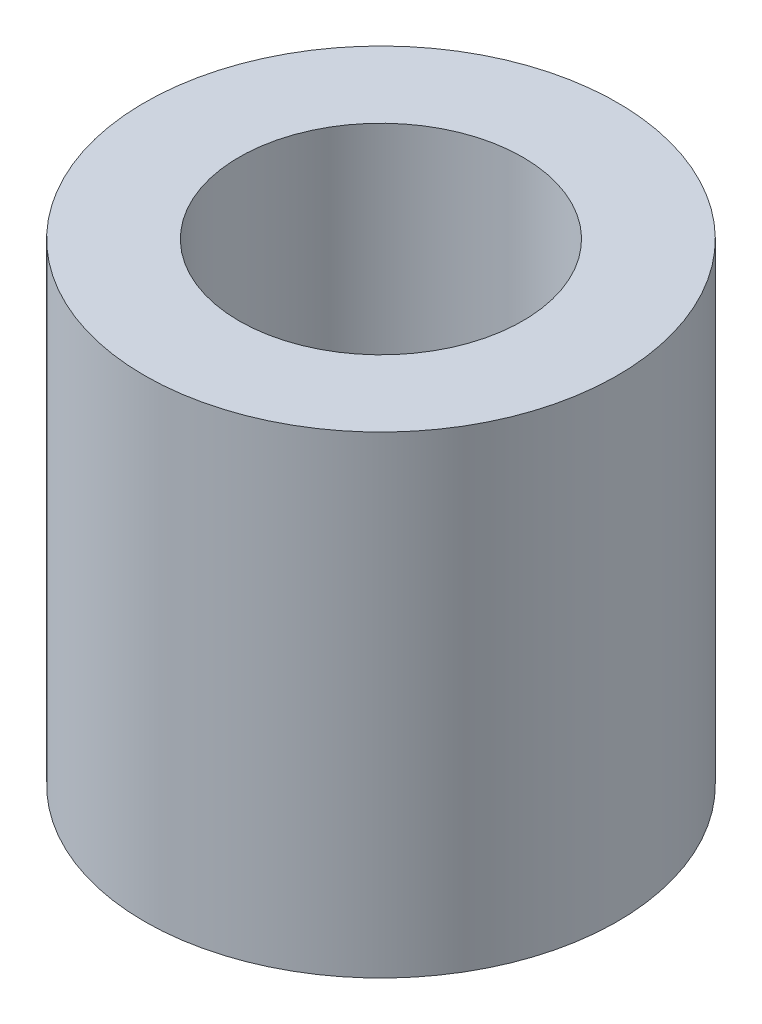
ISO-10303-21;
HEADER;
FILE_DESCRIPTION(('STEP AP214'),'2;1');
FILE_NAME('part.step','',(''),(''),'','','');
FILE_SCHEMA(('AUTOMOTIVE_DESIGN { 1 0 10303 214 1 1 1 1 }'));
ENDSEC;
DATA;
#1=APPLICATION_CONTEXT('core data for automotive mechanical design processes');
#2=APPLICATION_PROTOCOL_DEFINITION('international standard','automotive_design',2000,#1);
#3=PRODUCT_CONTEXT('',#1,'mechanical');
#4=PRODUCT('Part','Part','',(#3));
#5=PRODUCT_RELATED_PRODUCT_CATEGORY('part','',(#4));
#6=PRODUCT_DEFINITION_FORMATION('','',#4);
#7=PRODUCT_DEFINITION_CONTEXT('part definition',#1,'design');
#8=PRODUCT_DEFINITION('design','',#6,#7);
#9=PRODUCT_DEFINITION_SHAPE('','',#8);
#10=(LENGTH_UNIT() NAMED_UNIT(*) SI_UNIT(.MILLI.,.METRE.));
#11=(NAMED_UNIT(*) PLANE_ANGLE_UNIT() SI_UNIT($,.RADIAN.));
#12=(NAMED_UNIT(*) SI_UNIT($,.STERADIAN.) SOLID_ANGLE_UNIT());
#13=UNCERTAINTY_MEASURE_WITH_UNIT(LENGTH_MEASURE(1.E-05),#10,'distance_accuracy_value','');
#14=(GEOMETRIC_REPRESENTATION_CONTEXT(3) GLOBAL_UNCERTAINTY_ASSIGNED_CONTEXT((#13)) GLOBAL_UNIT_ASSIGNED_CONTEXT((#10,
#11,#12)) REPRESENTATION_CONTEXT('',''));
#15=CARTESIAN_POINT('',(0.,0.,0.));
#16=DIRECTION('',(0.,0.,1.));
#17=DIRECTION('',(1.,0.,0.));
#18=AXIS2_PLACEMENT_3D('',#15,#16,#17);
#19=CARTESIAN_POINT('',(0.,10.,0.));
#20=DIRECTION('',(0.,1.,0.));
#21=DIRECTION('',(0.,0.,1.));
#22=AXIS2_PLACEMENT_3D('',#19,#20,#21);
#23=PLANE('',#22);
#24=CARTESIAN_POINT('',(0.,10.,0.));
#25=DIRECTION('',(0.,1.,0.));
#26=DIRECTION('',(0.,0.,1.));
#27=AXIS2_PLACEMENT_3D('',#24,#25,#26);
#28=CIRCLE('',#27,5.);
#29=CARTESIAN_POINT('',(0.,10.,5.));
#30=VERTEX_POINT('',#29);
#31=EDGE_CURVE('E10',#30,#30,#28,.T.);
#32=ORIENTED_EDGE('',*,*,#31,.T.);
#33=EDGE_LOOP('',(#32));
#34=FACE_BOUND('',#33,.T.);
#35=CARTESIAN_POINT('',(0.,10.,0.));
#36=DIRECTION('',(0.,1.,0.));
#37=DIRECTION('',(0.,0.,1.));
#38=AXIS2_PLACEMENT_3D('',#35,#36,#37);
#39=CIRCLE('',#38,3.);
#40=CARTESIAN_POINT('',(0.,10.,3.));
#41=VERTEX_POINT('',#40);
#42=EDGE_CURVE('E47',#41,#41,#39,.T.);
#43=ORIENTED_EDGE('',*,*,#42,.F.);
#44=EDGE_LOOP('',(#43));
#45=FACE_BOUND('',#44,.T.);
#46=ADVANCED_FACE('F36',(#34,#45),#23,.T.);
#47=CARTESIAN_POINT('',(0.,0.,0.));
#48=DIRECTION('',(0.,1.,0.));
#49=DIRECTION('',(0.,0.,1.));
#50=AXIS2_PLACEMENT_3D('',#47,#48,#49);
#51=PLANE('',#50);
#52=CARTESIAN_POINT('',(0.,0.,0.));
#53=DIRECTION('',(0.,1.,0.));
#54=DIRECTION('',(0.,0.,1.));
#55=AXIS2_PLACEMENT_3D('',#52,#53,#54);
#56=CIRCLE('',#55,5.);
#57=CARTESIAN_POINT('',(0.,0.,5.));
#58=VERTEX_POINT('',#57);
#59=EDGE_CURVE('E45',#58,#58,#56,.T.);
#60=ORIENTED_EDGE('',*,*,#59,.F.);
#61=EDGE_LOOP('',(#60));
#62=FACE_BOUND('',#61,.T.);
#63=CARTESIAN_POINT('',(0.,0.,0.));
#64=DIRECTION('',(0.,1.,0.));
#65=DIRECTION('',(0.,0.,1.));
#66=AXIS2_PLACEMENT_3D('',#63,#64,#65);
#67=CIRCLE('',#66,3.);
#68=CARTESIAN_POINT('',(0.,0.,3.));
#69=VERTEX_POINT('',#68);
#70=EDGE_CURVE('E51',#69,#69,#67,.T.);
#71=ORIENTED_EDGE('',*,*,#70,.T.);
#72=EDGE_LOOP('',(#71));
#73=FACE_BOUND('',#72,.T.);
#74=ADVANCED_FACE('F63',(#62,#73),#51,.F.);
#75=CARTESIAN_POINT('',(0.,10.,0.));
#76=DIRECTION('',(0.,-1.,0.));
#77=DIRECTION('',(0.,0.,-1.));
#78=AXIS2_PLACEMENT_3D('',#75,#76,#77);
#79=CYLINDRICAL_SURFACE('',#78,5.);
#80=ORIENTED_EDGE('',*,*,#31,.F.);
#81=EDGE_LOOP('',(#80));
#82=FACE_BOUND('',#81,.T.);
#83=ORIENTED_EDGE('',*,*,#59,.T.);
#84=EDGE_LOOP('',(#83));
#85=FACE_BOUND('',#84,.T.);
#86=ADVANCED_FACE('F37',(#82,#85),#79,.T.);
#87=CARTESIAN_POINT('',(0.,10.,0.));
#88=DIRECTION('',(0.,-1.,0.));
#89=DIRECTION('',(0.,0.,-1.));
#90=AXIS2_PLACEMENT_3D('',#87,#88,#89);
#91=CYLINDRICAL_SURFACE('',#90,3.);
#92=ORIENTED_EDGE('',*,*,#42,.T.);
#93=EDGE_LOOP('',(#92));
#94=FACE_BOUND('',#93,.T.);
#95=ORIENTED_EDGE('',*,*,#70,.F.);
#96=EDGE_LOOP('',(#95));
#97=FACE_BOUND('',#96,.T.);
#98=ADVANCED_FACE('F60',(#94,#97),#91,.F.);
#99=CLOSED_SHELL('',(#46,#74,#86,#98));
#100=MANIFOLD_SOLID_BREP('B2',#99);
#101=ADVANCED_BREP_SHAPE_REPRESENTATION('',(#18,#100),#14);
#102=SHAPE_DEFINITION_REPRESENTATION(#9,#101);
ENDSEC;
END-ISO-10303-21;
